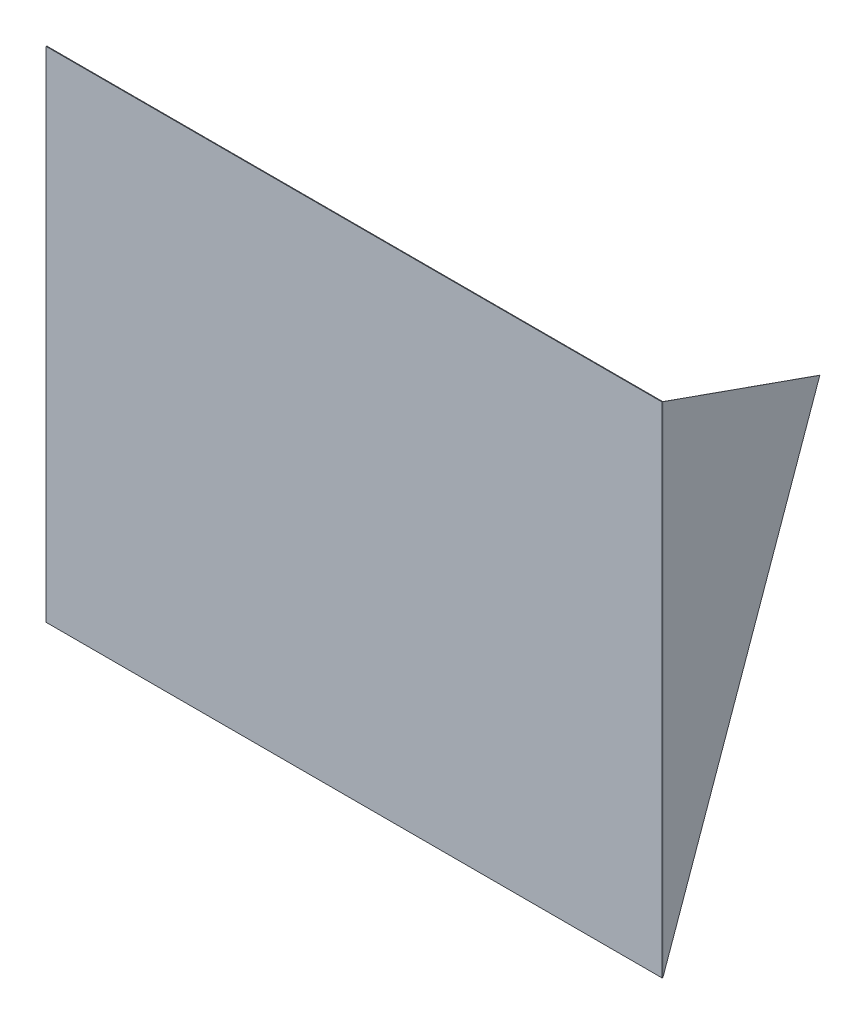
ISO-10303-21;
HEADER;
FILE_DESCRIPTION(('STEP AP214'),'2;1');
FILE_NAME('part.step','',(''),(''),'','','');
FILE_SCHEMA(('AUTOMOTIVE_DESIGN { 1 0 10303 214 1 1 1 1 }'));
ENDSEC;
DATA;
#1=APPLICATION_CONTEXT('core data for automotive mechanical design processes');
#2=APPLICATION_PROTOCOL_DEFINITION('international standard','automotive_design',2000,#1);
#3=PRODUCT_CONTEXT('',#1,'mechanical');
#4=PRODUCT('Part','Part','',(#3));
#5=PRODUCT_RELATED_PRODUCT_CATEGORY('part','',(#4));
#6=PRODUCT_DEFINITION_FORMATION('','',#4);
#7=PRODUCT_DEFINITION_CONTEXT('part definition',#1,'design');
#8=PRODUCT_DEFINITION('design','',#6,#7);
#9=PRODUCT_DEFINITION_SHAPE('','',#8);
#10=(LENGTH_UNIT() NAMED_UNIT(*) SI_UNIT(.MILLI.,.METRE.));
#11=(NAMED_UNIT(*) PLANE_ANGLE_UNIT() SI_UNIT($,.RADIAN.));
#12=(NAMED_UNIT(*) SI_UNIT($,.STERADIAN.) SOLID_ANGLE_UNIT());
#13=UNCERTAINTY_MEASURE_WITH_UNIT(LENGTH_MEASURE(1.E-05),#10,'distance_accuracy_value','');
#14=(GEOMETRIC_REPRESENTATION_CONTEXT(3) GLOBAL_UNCERTAINTY_ASSIGNED_CONTEXT((#13)) GLOBAL_UNIT_ASSIGNED_CONTEXT((#10,
#11,#12)) REPRESENTATION_CONTEXT('',''));
#15=CARTESIAN_POINT('',(0.,0.,0.));
#16=DIRECTION('',(0.,0.,1.));
#17=DIRECTION('',(1.,0.,0.));
#18=AXIS2_PLACEMENT_3D('',#15,#16,#17);
#19=CARTESIAN_POINT('',(1492.97738175482,-4760.96129237529,0.));
#20=DIRECTION('',(0.,0.,-1.));
#21=DIRECTION('',(-1.,0.,0.));
#22=AXIS2_PLACEMENT_3D('',#19,#20,#21);
#23=PLANE('',#22);
#24=DIRECTION('',(0.,-1.,0.));
#25=VECTOR('',#24,1.);
#26=CARTESIAN_POINT('',(1491.97738175482,-4760.96129237529,0.));
#27=LINE('',#26,#25);
#28=CARTESIAN_POINT('',(1491.97738175482,2689.03870762471,0.));
#29=VERTEX_POINT('',#28);
#30=CARTESIAN_POINT('',(1491.97738175482,-4760.96129237529,0.));
#31=VERTEX_POINT('',#30);
#32=EDGE_CURVE('E93',#29,#31,#27,.T.);
#33=ORIENTED_EDGE('',*,*,#32,.T.);
#34=DIRECTION('',(-1.,0.,0.));
#35=VECTOR('',#34,1.);
#36=CARTESIAN_POINT('',(1492.97738175482,-4760.96129237529,0.));
#37=LINE('',#36,#35);
#38=CARTESIAN_POINT('',(1492.97738175482,-4760.96129237529,0.));
#39=VERTEX_POINT('',#38);
#40=EDGE_CURVE('E12',#39,#31,#37,.T.);
#41=ORIENTED_EDGE('',*,*,#40,.F.);
#42=DIRECTION('',(0.,-1.,0.));
#43=VECTOR('',#42,1.);
#44=CARTESIAN_POINT('',(1492.97738175482,-4760.96129237529,0.));
#45=LINE('',#44,#43);
#46=CARTESIAN_POINT('',(1492.97738175482,2689.03870762471,0.));
#47=VERTEX_POINT('',#46);
#48=EDGE_CURVE('E86',#47,#39,#45,.T.);
#49=ORIENTED_EDGE('',*,*,#48,.F.);
#50=DIRECTION('',(-1.,0.,0.));
#51=VECTOR('',#50,1.);
#52=CARTESIAN_POINT('',(1492.97738175482,2689.03870762471,0.));
#53=LINE('',#52,#51);
#54=EDGE_CURVE('E94',#47,#29,#53,.T.);
#55=ORIENTED_EDGE('',*,*,#54,.T.);
#56=EDGE_LOOP('',(#33,#41,#49,#55));
#57=FACE_BOUND('',#56,.T.);
#58=ADVANCED_FACE('F46',(#57),#23,.F.);
#59=CARTESIAN_POINT('',(1492.97738175482,-4760.96129237529,0.));
#60=DIRECTION('',(0.,0.333806859233772,0.942641491092178));
#61=DIRECTION('',(0.,-0.942641491092178,0.333806859233772));
#62=AXIS2_PLACEMENT_3D('',#59,#60,#61);
#63=PLANE('',#62);
#64=DIRECTION('',(0.,0.942641491092178,-0.333806859233772));
#65=VECTOR('',#64,1.);
#66=CARTESIAN_POINT('',(1491.97738175482,-4760.96129237529,0.));
#67=LINE('',#66,#65);
#68=CARTESIAN_POINT('',(1491.97738175482,1858.90741405193,-2344.21845666065));
#69=VERTEX_POINT('',#68);
#70=EDGE_CURVE('E74',#31,#69,#67,.T.);
#71=ORIENTED_EDGE('',*,*,#70,.T.);
#72=DIRECTION('',(-1.,0.,0.));
#73=VECTOR('',#72,1.);
#74=CARTESIAN_POINT('',(1492.97738175482,1858.90741405193,-2344.21845666065));
#75=LINE('',#74,#73);
#76=CARTESIAN_POINT('',(1492.97738175482,1858.90741405193,-2344.21845666065));
#77=VERTEX_POINT('',#76);
#78=EDGE_CURVE('E54',#77,#69,#75,.T.);
#79=ORIENTED_EDGE('',*,*,#78,.F.);
#80=DIRECTION('',(0.,0.942641491092178,-0.333806859233772));
#81=VECTOR('',#80,1.);
#82=CARTESIAN_POINT('',(1492.97738175482,-4760.96129237529,0.));
#83=LINE('',#82,#81);
#84=EDGE_CURVE('E82',#39,#77,#83,.T.);
#85=ORIENTED_EDGE('',*,*,#84,.F.);
#86=ORIENTED_EDGE('',*,*,#40,.T.);
#87=EDGE_LOOP('',(#71,#79,#85,#86));
#88=FACE_BOUND('',#87,.T.);
#89=ADVANCED_FACE('F83',(#88),#63,.F.);
#90=CARTESIAN_POINT('',(1492.97738175482,1858.90741405193,-2344.21845666065));
#91=DIRECTION('',(0.,-0.942641491092178,0.333806859233771));
#92=DIRECTION('',(0.,-0.333806859233771,-0.942641491092178));
#93=AXIS2_PLACEMENT_3D('',#90,#91,#92);
#94=PLANE('',#93);
#95=DIRECTION('',(0.,0.333806859233772,0.942641491092178));
#96=VECTOR('',#95,1.);
#97=CARTESIAN_POINT('',(1491.97738175482,1858.90741405193,-2344.21845666065));
#98=LINE('',#97,#96);
#99=EDGE_CURVE('E79',#69,#29,#98,.T.);
#100=ORIENTED_EDGE('',*,*,#99,.T.);
#101=ORIENTED_EDGE('',*,*,#54,.F.);
#102=DIRECTION('',(0.,0.333806859233772,0.942641491092178));
#103=VECTOR('',#102,1.);
#104=CARTESIAN_POINT('',(1492.97738175482,1858.90741405193,-2344.21845666065));
#105=LINE('',#104,#103);
#106=EDGE_CURVE('E62',#77,#47,#105,.T.);
#107=ORIENTED_EDGE('',*,*,#106,.F.);
#108=ORIENTED_EDGE('',*,*,#78,.T.);
#109=EDGE_LOOP('',(#100,#101,#107,#108));
#110=FACE_BOUND('',#109,.T.);
#111=ADVANCED_FACE('F101',(#110),#94,.F.);
#112=CARTESIAN_POINT('',(1492.97738175482,1.77990643164433E-13,0.));
#113=DIRECTION('',(1.,0.,0.));
#114=DIRECTION('',(0.,1.,0.));
#115=AXIS2_PLACEMENT_3D('',#112,#113,#114);
#116=PLANE('',#115);
#117=ORIENTED_EDGE('',*,*,#48,.T.);
#118=ORIENTED_EDGE('',*,*,#84,.T.);
#119=ORIENTED_EDGE('',*,*,#106,.T.);
#120=EDGE_LOOP('',(#117,#118,#119));
#121=FACE_BOUND('',#120,.T.);
#122=ADVANCED_FACE('F89',(#121),#116,.T.);
#123=CARTESIAN_POINT('',(1491.97738175482,1.77871424584608E-13,0.));
#124=DIRECTION('',(1.,0.,0.));
#125=DIRECTION('',(0.,1.,0.));
#126=AXIS2_PLACEMENT_3D('',#123,#124,#125);
#127=PLANE('',#126);
#128=ORIENTED_EDGE('',*,*,#32,.F.);
#129=ORIENTED_EDGE('',*,*,#99,.F.);
#130=ORIENTED_EDGE('',*,*,#70,.F.);
#131=EDGE_LOOP('',(#128,#129,#130));
#132=FACE_BOUND('',#131,.T.);
#133=ADVANCED_FACE('F102',(#132),#127,.F.);
#134=CLOSED_SHELL('',(#58,#89,#111,#122,#133));
#135=MANIFOLD_SOLID_BREP('B2',#134);
#136=CARTESIAN_POINT('',(1491.97738175482,2689.03870762471,10.));
#137=DIRECTION('',(-1.,0.,0.));
#138=DIRECTION('',(0.,-1.,0.));
#139=AXIS2_PLACEMENT_3D('',#136,#137,#138);
#140=PLANE('',#139);
#141=DIRECTION('',(0.,1.,0.));
#142=VECTOR('',#141,1.);
#143=CARTESIAN_POINT('',(1491.97738175482,2689.03870762471,0.));
#144=LINE('',#143,#142);
#145=CARTESIAN_POINT('',(1491.97738175482,-4760.96129237529,0.));
#146=VERTEX_POINT('',#145);
#147=CARTESIAN_POINT('',(1491.97738175482,2689.03870762471,0.));
#148=VERTEX_POINT('',#147);
#149=EDGE_CURVE('E206',#146,#148,#144,.T.);
#150=ORIENTED_EDGE('',*,*,#149,.T.);
#151=DIRECTION('',(0.,0.,-1.));
#152=VECTOR('',#151,1.);
#153=CARTESIAN_POINT('',(1491.97738175482,2689.03870762471,10.));
#154=LINE('',#153,#152);
#155=CARTESIAN_POINT('',(1491.97738175482,2689.03870762471,10.));
#156=VERTEX_POINT('',#155);
#157=EDGE_CURVE('E44',#156,#148,#154,.T.);
#158=ORIENTED_EDGE('',*,*,#157,.F.);
#159=DIRECTION('',(0.,1.,0.));
#160=VECTOR('',#159,1.);
#161=CARTESIAN_POINT('',(1491.97738175482,2689.03870762471,10.));
#162=LINE('',#161,#160);
#163=CARTESIAN_POINT('',(1491.97738175482,-4760.96129237529,10.));
#164=VERTEX_POINT('',#163);
#165=EDGE_CURVE('E194',#164,#156,#162,.T.);
#166=ORIENTED_EDGE('',*,*,#165,.F.);
#167=DIRECTION('',(0.,0.,-1.));
#168=VECTOR('',#167,1.);
#169=CARTESIAN_POINT('',(1491.97738175482,-4760.96129237529,10.));
#170=LINE('',#169,#168);
#171=EDGE_CURVE('E202',#164,#146,#170,.T.);
#172=ORIENTED_EDGE('',*,*,#171,.T.);
#173=EDGE_LOOP('',(#150,#158,#166,#172));
#174=FACE_BOUND('',#173,.T.);
#175=ADVANCED_FACE('F143',(#174),#140,.F.);
#176=CARTESIAN_POINT('',(1491.97738175482,2689.03870762471,10.));
#177=DIRECTION('',(0.,-1.,0.));
#178=DIRECTION('',(0.,0.,-1.));
#179=AXIS2_PLACEMENT_3D('',#176,#177,#178);
#180=PLANE('',#179);
#181=DIRECTION('',(-1.,0.,0.));
#182=VECTOR('',#181,1.);
#183=CARTESIAN_POINT('',(1491.97738175482,2689.03870762471,0.));
#184=LINE('',#183,#182);
#185=CARTESIAN_POINT('',(-7708.02261824518,2689.03870762471,0.));
#186=VERTEX_POINT('',#185);
#187=EDGE_CURVE('E198',#148,#186,#184,.T.);
#188=ORIENTED_EDGE('',*,*,#187,.T.);
#189=DIRECTION('',(0.,0.,-1.));
#190=VECTOR('',#189,1.);
#191=CARTESIAN_POINT('',(-7708.02261824518,2689.03870762471,10.));
#192=LINE('',#191,#190);
#193=CARTESIAN_POINT('',(-7708.02261824518,2689.03870762471,10.));
#194=VERTEX_POINT('',#193);
#195=EDGE_CURVE('E151',#194,#186,#192,.T.);
#196=ORIENTED_EDGE('',*,*,#195,.F.);
#197=DIRECTION('',(-1.,0.,0.));
#198=VECTOR('',#197,1.);
#199=CARTESIAN_POINT('',(1491.97738175482,2689.03870762471,10.));
#200=LINE('',#199,#198);
#201=EDGE_CURVE('E189',#156,#194,#200,.T.);
#202=ORIENTED_EDGE('',*,*,#201,.F.);
#203=ORIENTED_EDGE('',*,*,#157,.T.);
#204=EDGE_LOOP('',(#188,#196,#202,#203));
#205=FACE_BOUND('',#204,.T.);
#206=ADVANCED_FACE('F197',(#205),#180,.F.);
#207=CARTESIAN_POINT('',(-7708.02261824518,2689.03870762471,10.));
#208=DIRECTION('',(1.,0.,0.));
#209=DIRECTION('',(0.,1.,0.));
#210=AXIS2_PLACEMENT_3D('',#207,#208,#209);
#211=PLANE('',#210);
#212=DIRECTION('',(0.,-1.,0.));
#213=VECTOR('',#212,1.);
#214=CARTESIAN_POINT('',(-7708.02261824518,2689.03870762471,0.));
#215=LINE('',#214,#213);
#216=CARTESIAN_POINT('',(-7708.02261824518,-4760.96129237529,0.));
#217=VERTEX_POINT('',#216);
#218=EDGE_CURVE('E176',#186,#217,#215,.T.);
#219=ORIENTED_EDGE('',*,*,#218,.T.);
#220=DIRECTION('',(0.,0.,-1.));
#221=VECTOR('',#220,1.);
#222=CARTESIAN_POINT('',(-7708.02261824518,-4760.96129237529,10.));
#223=LINE('',#222,#221);
#224=CARTESIAN_POINT('',(-7708.02261824518,-4760.96129237529,10.));
#225=VERTEX_POINT('',#224);
#226=EDGE_CURVE('E199',#225,#217,#223,.T.);
#227=ORIENTED_EDGE('',*,*,#226,.F.);
#228=DIRECTION('',(0.,-1.,0.));
#229=VECTOR('',#228,1.);
#230=CARTESIAN_POINT('',(-7708.02261824518,2689.03870762471,10.));
#231=LINE('',#230,#229);
#232=EDGE_CURVE('E192',#194,#225,#231,.T.);
#233=ORIENTED_EDGE('',*,*,#232,.F.);
#234=ORIENTED_EDGE('',*,*,#195,.T.);
#235=EDGE_LOOP('',(#219,#227,#233,#234));
#236=FACE_BOUND('',#235,.T.);
#237=ADVANCED_FACE('F200',(#236),#211,.F.);
#238=CARTESIAN_POINT('',(1491.97738175482,-4760.96129237529,10.));
#239=DIRECTION('',(0.,1.,0.));
#240=DIRECTION('',(-1.,0.,0.));
#241=AXIS2_PLACEMENT_3D('',#238,#239,#240);
#242=PLANE('',#241);
#243=DIRECTION('',(1.,0.,0.));
#244=VECTOR('',#243,1.);
#245=CARTESIAN_POINT('',(1491.97738175482,-4760.96129237529,0.));
#246=LINE('',#245,#244);
#247=EDGE_CURVE('E182',#217,#146,#246,.T.);
#248=ORIENTED_EDGE('',*,*,#247,.T.);
#249=ORIENTED_EDGE('',*,*,#171,.F.);
#250=DIRECTION('',(1.,0.,0.));
#251=VECTOR('',#250,1.);
#252=CARTESIAN_POINT('',(1491.97738175482,-4760.96129237529,10.));
#253=LINE('',#252,#251);
#254=EDGE_CURVE('E159',#225,#164,#253,.T.);
#255=ORIENTED_EDGE('',*,*,#254,.F.);
#256=ORIENTED_EDGE('',*,*,#226,.T.);
#257=EDGE_LOOP('',(#248,#249,#255,#256));
#258=FACE_BOUND('',#257,.T.);
#259=ADVANCED_FACE('F213',(#258),#242,.F.);
#260=CARTESIAN_POINT('',(0.,0.,10.));
#261=DIRECTION('',(0.,0.,-1.));
#262=DIRECTION('',(-1.,0.,0.));
#263=AXIS2_PLACEMENT_3D('',#260,#261,#262);
#264=PLANE('',#263);
#265=ORIENTED_EDGE('',*,*,#165,.T.);
#266=ORIENTED_EDGE('',*,*,#201,.T.);
#267=ORIENTED_EDGE('',*,*,#232,.T.);
#268=ORIENTED_EDGE('',*,*,#254,.T.);
#269=EDGE_LOOP('',(#265,#266,#267,#268));
#270=FACE_BOUND('',#269,.T.);
#271=ADVANCED_FACE('F190',(#270),#264,.F.);
#272=CARTESIAN_POINT('',(0.,0.,0.));
#273=DIRECTION('',(0.,0.,-1.));
#274=DIRECTION('',(-1.,0.,0.));
#275=AXIS2_PLACEMENT_3D('',#272,#273,#274);
#276=PLANE('',#275);
#277=ORIENTED_EDGE('',*,*,#149,.F.);
#278=ORIENTED_EDGE('',*,*,#247,.F.);
#279=ORIENTED_EDGE('',*,*,#218,.F.);
#280=ORIENTED_EDGE('',*,*,#187,.F.);
#281=EDGE_LOOP('',(#277,#278,#279,#280));
#282=FACE_BOUND('',#281,.T.);
#283=ADVANCED_FACE('F216',(#282),#276,.T.);
#284=CLOSED_SHELL('',(#175,#206,#237,#259,#271,#283));
#285=MANIFOLD_SOLID_BREP('B6',#284);
#286=ADVANCED_BREP_SHAPE_REPRESENTATION('',(#18,#135,#285),#14);
#287=SHAPE_DEFINITION_REPRESENTATION(#9,#286);
ENDSEC;
END-ISO-10303-21;
